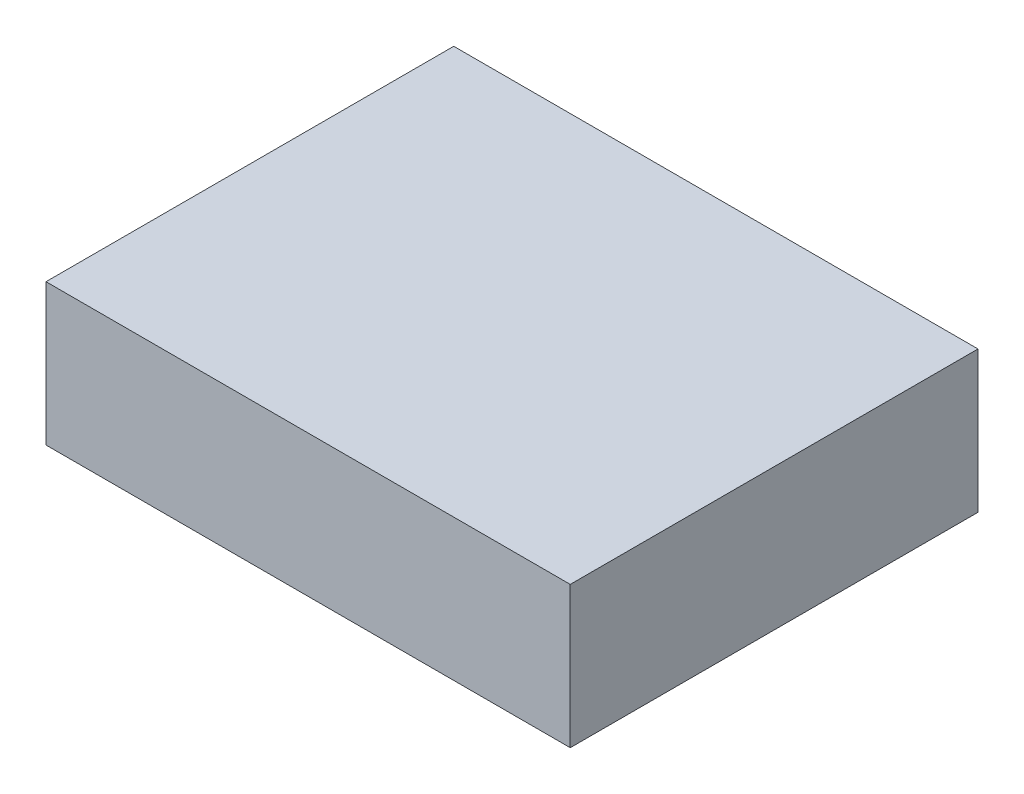
ISO-10303-21;
HEADER;
FILE_DESCRIPTION(('STEP AP214'),'2;1');
FILE_NAME('part.step','',(''),(''),'','','');
FILE_SCHEMA(('AUTOMOTIVE_DESIGN { 1 0 10303 214 1 1 1 1 }'));
ENDSEC;
DATA;
#1=APPLICATION_CONTEXT('core data for automotive mechanical design processes');
#2=APPLICATION_PROTOCOL_DEFINITION('international standard','automotive_design',2000,#1);
#3=PRODUCT_CONTEXT('',#1,'mechanical');
#4=PRODUCT('Part','Part','',(#3));
#5=PRODUCT_RELATED_PRODUCT_CATEGORY('part','',(#4));
#6=PRODUCT_DEFINITION_FORMATION('','',#4);
#7=PRODUCT_DEFINITION_CONTEXT('part definition',#1,'design');
#8=PRODUCT_DEFINITION('design','',#6,#7);
#9=PRODUCT_DEFINITION_SHAPE('','',#8);
#10=(LENGTH_UNIT() NAMED_UNIT(*) SI_UNIT(.MILLI.,.METRE.));
#11=(NAMED_UNIT(*) PLANE_ANGLE_UNIT() SI_UNIT($,.RADIAN.));
#12=(NAMED_UNIT(*) SI_UNIT($,.STERADIAN.) SOLID_ANGLE_UNIT());
#13=UNCERTAINTY_MEASURE_WITH_UNIT(LENGTH_MEASURE(1.E-05),#10,'distance_accuracy_value','');
#14=(GEOMETRIC_REPRESENTATION_CONTEXT(3) GLOBAL_UNCERTAINTY_ASSIGNED_CONTEXT((#13)) GLOBAL_UNIT_ASSIGNED_CONTEXT((#10,
#11,#12)) REPRESENTATION_CONTEXT('',''));
#15=CARTESIAN_POINT('',(0.,0.,0.));
#16=DIRECTION('',(0.,0.,1.));
#17=DIRECTION('',(1.,0.,0.));
#18=AXIS2_PLACEMENT_3D('',#15,#16,#17);
#19=CARTESIAN_POINT('',(3.15000132,0.85000084,0.));
#20=DIRECTION('',(0.,-1.,0.));
#21=DIRECTION('',(0.,0.,-1.));
#22=AXIS2_PLACEMENT_3D('',#19,#20,#21);
#23=PLANE('',#22);
#24=DIRECTION('',(0.,0.,-1.));
#25=VECTOR('',#24,1.);
#26=CARTESIAN_POINT('',(-3.14999878,0.85000084,0.));
#27=LINE('',#26,#25);
#28=CARTESIAN_POINT('',(-3.14999878,0.85000084,0.));
#29=VERTEX_POINT('',#28);
#30=CARTESIAN_POINT('',(-3.14999878,0.85000084,4.90000036));
#31=VERTEX_POINT('',#30);
#32=EDGE_CURVE('E20',#29,#31,#27,.F.);
#33=ORIENTED_EDGE('',*,*,#32,.T.);
#34=DIRECTION('',(-1.,0.,0.));
#35=VECTOR('',#34,1.);
#36=CARTESIAN_POINT('',(-3.14999878,0.85000084,4.90000036));
#37=LINE('',#36,#35);
#38=CARTESIAN_POINT('',(3.15000132,0.85000084,4.90000036));
#39=VERTEX_POINT('',#38);
#40=EDGE_CURVE('E55',#31,#39,#37,.F.);
#41=ORIENTED_EDGE('',*,*,#40,.T.);
#42=DIRECTION('',(0.,0.,1.));
#43=VECTOR('',#42,1.);
#44=CARTESIAN_POINT('',(3.15000132,0.85000084,0.));
#45=LINE('',#44,#43);
#46=CARTESIAN_POINT('',(3.15000132,0.85000084,0.));
#47=VERTEX_POINT('',#46);
#48=EDGE_CURVE('E76',#39,#47,#45,.F.);
#49=ORIENTED_EDGE('',*,*,#48,.T.);
#50=DIRECTION('',(-1.,0.,0.));
#51=VECTOR('',#50,1.);
#52=CARTESIAN_POINT('',(-3.14999878,0.85000084,0.));
#53=LINE('',#52,#51);
#54=EDGE_CURVE('E58',#29,#47,#53,.F.);
#55=ORIENTED_EDGE('',*,*,#54,.F.);
#56=EDGE_LOOP('',(#33,#41,#49,#55));
#57=FACE_BOUND('',#56,.T.);
#58=ADVANCED_FACE('F17',(#57),#23,.F.);
#59=CARTESIAN_POINT('',(-3.14999878,0.85000084,0.));
#60=DIRECTION('',(1.,0.,0.));
#61=DIRECTION('',(0.,0.,-1.));
#62=AXIS2_PLACEMENT_3D('',#59,#60,#61);
#63=PLANE('',#62);
#64=DIRECTION('',(0.,0.,1.));
#65=VECTOR('',#64,1.);
#66=CARTESIAN_POINT('',(-3.14999878,-0.8499983,0.));
#67=LINE('',#66,#65);
#68=CARTESIAN_POINT('',(-3.14999878,-0.8499983,0.));
#69=VERTEX_POINT('',#68);
#70=CARTESIAN_POINT('',(-3.14999878,-0.8499983,4.90000036));
#71=VERTEX_POINT('',#70);
#72=EDGE_CURVE('E73',#69,#71,#67,.T.);
#73=ORIENTED_EDGE('',*,*,#72,.T.);
#74=DIRECTION('',(0.,1.,0.));
#75=VECTOR('',#74,1.);
#76=CARTESIAN_POINT('',(-3.14999878,-0.8499983,4.90000036));
#77=LINE('',#76,#75);
#78=EDGE_CURVE('E63',#71,#31,#77,.T.);
#79=ORIENTED_EDGE('',*,*,#78,.T.);
#80=ORIENTED_EDGE('',*,*,#32,.F.);
#81=DIRECTION('',(0.,1.,0.));
#82=VECTOR('',#81,1.);
#83=CARTESIAN_POINT('',(-3.14999878,-0.8499983,0.));
#84=LINE('',#83,#82);
#85=EDGE_CURVE('E78',#69,#29,#84,.T.);
#86=ORIENTED_EDGE('',*,*,#85,.F.);
#87=EDGE_LOOP('',(#73,#79,#80,#86));
#88=FACE_BOUND('',#87,.T.);
#89=ADVANCED_FACE('F72',(#88),#63,.F.);
#90=CARTESIAN_POINT('',(-3.14999878,-0.8499983,4.90000036));
#91=DIRECTION('',(0.,0.,-1.));
#92=DIRECTION('',(-1.,0.,0.));
#93=AXIS2_PLACEMENT_3D('',#90,#91,#92);
#94=PLANE('',#93);
#95=DIRECTION('',(0.,1.,0.));
#96=VECTOR('',#95,1.);
#97=CARTESIAN_POINT('',(3.15000132,-0.8499983,4.90000036));
#98=LINE('',#97,#96);
#99=CARTESIAN_POINT('',(3.15000132,-0.8499983,4.90000036));
#100=VERTEX_POINT('',#99);
#101=EDGE_CURVE('E69',#100,#39,#98,.T.);
#102=ORIENTED_EDGE('',*,*,#101,.T.);
#103=ORIENTED_EDGE('',*,*,#40,.F.);
#104=ORIENTED_EDGE('',*,*,#78,.F.);
#105=DIRECTION('',(1.,0.,0.));
#106=VECTOR('',#105,1.);
#107=CARTESIAN_POINT('',(-3.14999878,-0.8499983,4.90000036));
#108=LINE('',#107,#106);
#109=EDGE_CURVE('E83',#71,#100,#108,.T.);
#110=ORIENTED_EDGE('',*,*,#109,.T.);
#111=EDGE_LOOP('',(#102,#103,#104,#110));
#112=FACE_BOUND('',#111,.T.);
#113=ADVANCED_FACE('F66',(#112),#94,.F.);
#114=CARTESIAN_POINT('',(3.15000132,-0.8499983,0.));
#115=DIRECTION('',(-1.,0.,0.));
#116=DIRECTION('',(0.,0.,1.));
#117=AXIS2_PLACEMENT_3D('',#114,#115,#116);
#118=PLANE('',#117);
#119=ORIENTED_EDGE('',*,*,#48,.F.);
#120=ORIENTED_EDGE('',*,*,#101,.F.);
#121=DIRECTION('',(0.,0.,1.));
#122=VECTOR('',#121,1.);
#123=CARTESIAN_POINT('',(3.15000132,-0.8499983,0.));
#124=LINE('',#123,#122);
#125=CARTESIAN_POINT('',(3.15000132,-0.8499983,0.));
#126=VERTEX_POINT('',#125);
#127=EDGE_CURVE('E26',#100,#126,#124,.F.);
#128=ORIENTED_EDGE('',*,*,#127,.T.);
#129=DIRECTION('',(0.,1.,0.));
#130=VECTOR('',#129,1.);
#131=CARTESIAN_POINT('',(3.15000132,-0.8499983,0.));
#132=LINE('',#131,#130);
#133=EDGE_CURVE('E34',#47,#126,#132,.F.);
#134=ORIENTED_EDGE('',*,*,#133,.F.);
#135=EDGE_LOOP('',(#119,#120,#128,#134));
#136=FACE_BOUND('',#135,.T.);
#137=ADVANCED_FACE('F88',(#136),#118,.F.);
#138=CARTESIAN_POINT('',(-3.14999878,-0.8499983,0.));
#139=DIRECTION('',(0.,0.,-1.));
#140=DIRECTION('',(-1.,0.,0.));
#141=AXIS2_PLACEMENT_3D('',#138,#139,#140);
#142=PLANE('',#141);
#143=ORIENTED_EDGE('',*,*,#133,.T.);
#144=DIRECTION('',(1.,0.,0.));
#145=VECTOR('',#144,1.);
#146=CARTESIAN_POINT('',(-3.14999878,-0.8499983,0.));
#147=LINE('',#146,#145);
#148=EDGE_CURVE('E11',#126,#69,#147,.F.);
#149=ORIENTED_EDGE('',*,*,#148,.T.);
#150=ORIENTED_EDGE('',*,*,#85,.T.);
#151=ORIENTED_EDGE('',*,*,#54,.T.);
#152=EDGE_LOOP('',(#143,#149,#150,#151));
#153=FACE_BOUND('',#152,.T.);
#154=ADVANCED_FACE('F91',(#153),#142,.T.);
#155=CARTESIAN_POINT('',(-3.14999878,-0.8499983,0.));
#156=DIRECTION('',(0.,1.,0.));
#157=DIRECTION('',(0.,0.,1.));
#158=AXIS2_PLACEMENT_3D('',#155,#156,#157);
#159=PLANE('',#158);
#160=ORIENTED_EDGE('',*,*,#127,.F.);
#161=ORIENTED_EDGE('',*,*,#109,.F.);
#162=ORIENTED_EDGE('',*,*,#72,.F.);
#163=ORIENTED_EDGE('',*,*,#148,.F.);
#164=EDGE_LOOP('',(#160,#161,#162,#163));
#165=FACE_BOUND('',#164,.T.);
#166=ADVANCED_FACE('F90',(#165),#159,.F.);
#167=CLOSED_SHELL('',(#58,#89,#113,#137,#154,#166));
#168=MANIFOLD_SOLID_BREP('B1',#167);
#169=ADVANCED_BREP_SHAPE_REPRESENTATION('',(#18,#168),#14);
#170=SHAPE_DEFINITION_REPRESENTATION(#9,#169);
ENDSEC;
END-ISO-10303-21;
